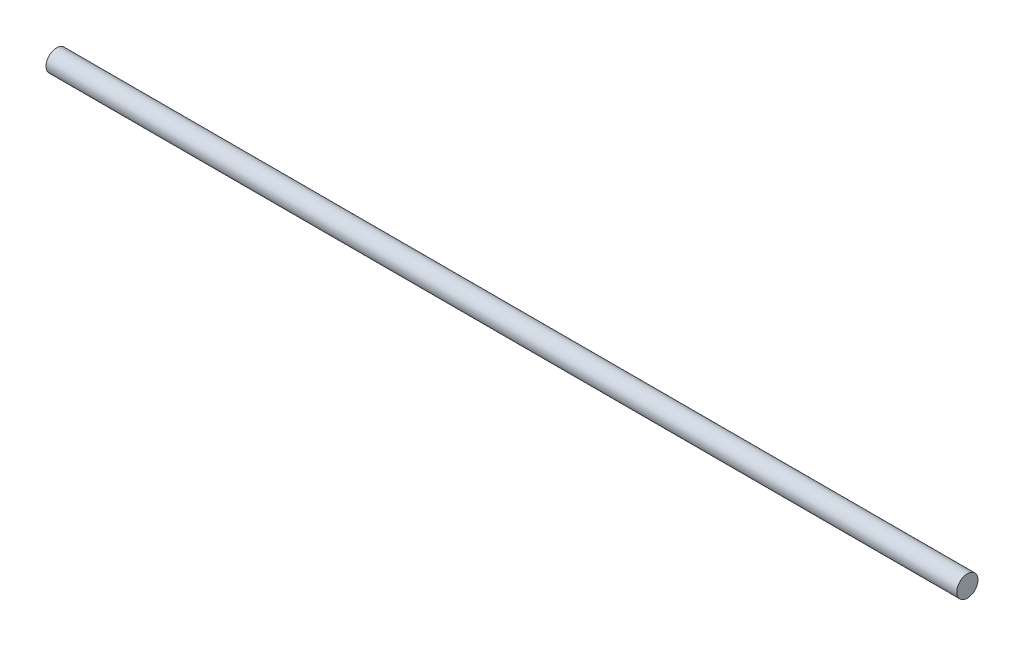
ISO-10303-21;
HEADER;
FILE_DESCRIPTION(('STEP AP214'),'2;1');
FILE_NAME('part.step','',(''),(''),'','','');
FILE_SCHEMA(('AUTOMOTIVE_DESIGN { 1 0 10303 214 1 1 1 1 }'));
ENDSEC;
DATA;
#1=APPLICATION_CONTEXT('core data for automotive mechanical design processes');
#2=APPLICATION_PROTOCOL_DEFINITION('international standard','automotive_design',2000,#1);
#3=PRODUCT_CONTEXT('',#1,'mechanical');
#4=PRODUCT('Part','Part','',(#3));
#5=PRODUCT_RELATED_PRODUCT_CATEGORY('part','',(#4));
#6=PRODUCT_DEFINITION_FORMATION('','',#4);
#7=PRODUCT_DEFINITION_CONTEXT('part definition',#1,'design');
#8=PRODUCT_DEFINITION('design','',#6,#7);
#9=PRODUCT_DEFINITION_SHAPE('','',#8);
#10=(LENGTH_UNIT() NAMED_UNIT(*) SI_UNIT(.MILLI.,.METRE.));
#11=(NAMED_UNIT(*) PLANE_ANGLE_UNIT() SI_UNIT($,.RADIAN.));
#12=(NAMED_UNIT(*) SI_UNIT($,.STERADIAN.) SOLID_ANGLE_UNIT());
#13=UNCERTAINTY_MEASURE_WITH_UNIT(LENGTH_MEASURE(1.E-05),#10,'distance_accuracy_value','');
#14=(GEOMETRIC_REPRESENTATION_CONTEXT(3) GLOBAL_UNCERTAINTY_ASSIGNED_CONTEXT((#13)) GLOBAL_UNIT_ASSIGNED_CONTEXT((#10,
#11,#12)) REPRESENTATION_CONTEXT('',''));
#15=CARTESIAN_POINT('',(0.,0.,0.));
#16=DIRECTION('',(0.,0.,1.));
#17=DIRECTION('',(1.,0.,0.));
#18=AXIS2_PLACEMENT_3D('',#15,#16,#17);
#19=CARTESIAN_POINT('',(191.5,0.,0.));
#20=DIRECTION('',(-1.,0.,0.));
#21=DIRECTION('',(0.,0.,1.));
#22=AXIS2_PLACEMENT_3D('',#19,#20,#21);
#23=CYLINDRICAL_SURFACE('',#22,4.);
#24=CARTESIAN_POINT('',(-191.5,0.,0.));
#25=DIRECTION('',(1.,0.,0.));
#26=DIRECTION('',(0.,0.,-1.));
#27=AXIS2_PLACEMENT_3D('',#24,#25,#26);
#28=CIRCLE('',#27,4.);
#29=CARTESIAN_POINT('',(-191.5,0.,-4.));
#30=VERTEX_POINT('',#29);
#31=EDGE_CURVE('E10',#30,#30,#28,.T.);
#32=ORIENTED_EDGE('',*,*,#31,.T.);
#33=EDGE_LOOP('',(#32));
#34=FACE_BOUND('',#33,.T.);
#35=CARTESIAN_POINT('',(151.5,0.,0.));
#36=DIRECTION('',(1.,0.,0.));
#37=DIRECTION('',(0.,0.,-1.));
#38=AXIS2_PLACEMENT_3D('',#35,#36,#37);
#39=CIRCLE('',#38,4.);
#40=CARTESIAN_POINT('',(151.5,0.,-4.));
#41=VERTEX_POINT('',#40);
#42=EDGE_CURVE('E47',#41,#41,#39,.T.);
#43=ORIENTED_EDGE('',*,*,#42,.F.);
#44=EDGE_LOOP('',(#43));
#45=FACE_BOUND('',#44,.T.);
#46=ADVANCED_FACE('F41',(#34,#45),#23,.T.);
#47=CARTESIAN_POINT('',(-191.5,0.,0.));
#48=DIRECTION('',(1.,0.,0.));
#49=DIRECTION('',(0.,0.,-1.));
#50=AXIS2_PLACEMENT_3D('',#47,#48,#49);
#51=PLANE('',#50);
#52=ORIENTED_EDGE('',*,*,#31,.F.);
#53=EDGE_LOOP('',(#52));
#54=FACE_BOUND('',#53,.T.);
#55=ADVANCED_FACE('F56',(#54),#51,.F.);
#56=CARTESIAN_POINT('',(151.5,0.,0.));
#57=DIRECTION('',(1.,0.,0.));
#58=DIRECTION('',(0.,0.,-1.));
#59=AXIS2_PLACEMENT_3D('',#56,#57,#58);
#60=PLANE('',#59);
#61=ORIENTED_EDGE('',*,*,#42,.T.);
#62=EDGE_LOOP('',(#61));
#63=FACE_BOUND('',#62,.T.);
#64=ADVANCED_FACE('F53',(#63),#60,.T.);
#65=CLOSED_SHELL('',(#46,#55,#64));
#66=MANIFOLD_SOLID_BREP('B2',#65);
#67=ADVANCED_BREP_SHAPE_REPRESENTATION('',(#18,#66),#14);
#68=SHAPE_DEFINITION_REPRESENTATION(#9,#67);
ENDSEC;
END-ISO-10303-21;
